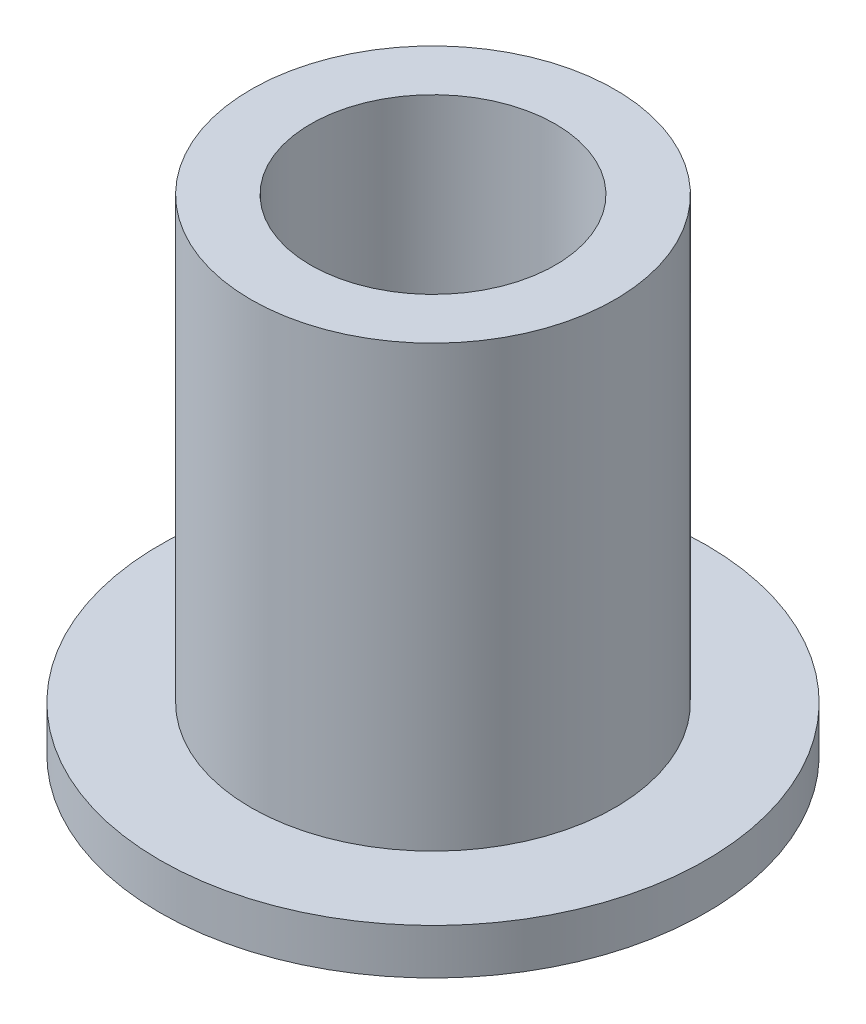
ISO-10303-21;
HEADER;
FILE_DESCRIPTION(('STEP AP214'),'2;1');
FILE_NAME('part.step','',(''),(''),'','','');
FILE_SCHEMA(('AUTOMOTIVE_DESIGN { 1 0 10303 214 1 1 1 1 }'));
ENDSEC;
DATA;
#1=APPLICATION_CONTEXT('core data for automotive mechanical design processes');
#2=APPLICATION_PROTOCOL_DEFINITION('international standard','automotive_design',2000,#1);
#3=PRODUCT_CONTEXT('',#1,'mechanical');
#4=PRODUCT('Part','Part','',(#3));
#5=PRODUCT_RELATED_PRODUCT_CATEGORY('part','',(#4));
#6=PRODUCT_DEFINITION_FORMATION('','',#4);
#7=PRODUCT_DEFINITION_CONTEXT('part definition',#1,'design');
#8=PRODUCT_DEFINITION('design','',#6,#7);
#9=PRODUCT_DEFINITION_SHAPE('','',#8);
#10=(LENGTH_UNIT() NAMED_UNIT(*) SI_UNIT(.MILLI.,.METRE.));
#11=(NAMED_UNIT(*) PLANE_ANGLE_UNIT() SI_UNIT($,.RADIAN.));
#12=(NAMED_UNIT(*) SI_UNIT($,.STERADIAN.) SOLID_ANGLE_UNIT());
#13=UNCERTAINTY_MEASURE_WITH_UNIT(LENGTH_MEASURE(1.E-05),#10,'distance_accuracy_value','');
#14=(GEOMETRIC_REPRESENTATION_CONTEXT(3) GLOBAL_UNCERTAINTY_ASSIGNED_CONTEXT((#13)) GLOBAL_UNIT_ASSIGNED_CONTEXT((#10,
#11,#12)) REPRESENTATION_CONTEXT('',''));
#15=CARTESIAN_POINT('',(0.,0.,0.));
#16=DIRECTION('',(0.,0.,1.));
#17=DIRECTION('',(1.,0.,0.));
#18=AXIS2_PLACEMENT_3D('',#15,#16,#17);
#19=CARTESIAN_POINT('',(0.,12.7,0.));
#20=DIRECTION('',(0.,1.,0.));
#21=DIRECTION('',(0.,0.,1.));
#22=AXIS2_PLACEMENT_3D('',#19,#20,#21);
#23=PLANE('',#22);
#24=CARTESIAN_POINT('',(0.,12.7,0.));
#25=DIRECTION('',(0.,1.,0.));
#26=DIRECTION('',(0.,0.,1.));
#27=AXIS2_PLACEMENT_3D('',#24,#25,#26);
#28=CIRCLE('',#27,4.7625);
#29=CARTESIAN_POINT('',(0.,12.7,4.7625));
#30=VERTEX_POINT('',#29);
#31=EDGE_CURVE('E10',#30,#30,#28,.T.);
#32=ORIENTED_EDGE('',*,*,#31,.T.);
#33=EDGE_LOOP('',(#32));
#34=FACE_BOUND('',#33,.T.);
#35=CARTESIAN_POINT('',(0.,12.7,0.));
#36=DIRECTION('',(0.,1.,0.));
#37=DIRECTION('',(0.,0.,1.));
#38=AXIS2_PLACEMENT_3D('',#35,#36,#37);
#39=CIRCLE('',#38,3.2004);
#40=CARTESIAN_POINT('',(0.,12.7,3.2004));
#41=VERTEX_POINT('',#40);
#42=EDGE_CURVE('E37',#41,#41,#39,.T.);
#43=ORIENTED_EDGE('',*,*,#42,.F.);
#44=EDGE_LOOP('',(#43));
#45=FACE_BOUND('',#44,.T.);
#46=ADVANCED_FACE('F30',(#34,#45),#23,.T.);
#47=CARTESIAN_POINT('',(0.,0.,0.));
#48=DIRECTION('',(0.,1.,0.));
#49=DIRECTION('',(0.,0.,1.));
#50=AXIS2_PLACEMENT_3D('',#47,#48,#49);
#51=PLANE('',#50);
#52=CARTESIAN_POINT('',(0.,0.,0.));
#53=DIRECTION('',(0.,1.,0.));
#54=DIRECTION('',(0.,0.,1.));
#55=AXIS2_PLACEMENT_3D('',#52,#53,#54);
#56=CIRCLE('',#55,3.2004);
#57=CARTESIAN_POINT('',(0.,0.,3.2004));
#58=VERTEX_POINT('',#57);
#59=EDGE_CURVE('E41',#58,#58,#56,.T.);
#60=ORIENTED_EDGE('',*,*,#59,.T.);
#61=EDGE_LOOP('',(#60));
#62=FACE_BOUND('',#61,.T.);
#63=CARTESIAN_POINT('',(0.,0.,0.));
#64=DIRECTION('',(0.,1.,0.));
#65=DIRECTION('',(0.,0.,1.));
#66=AXIS2_PLACEMENT_3D('',#63,#64,#65);
#67=CIRCLE('',#66,7.14375);
#68=CARTESIAN_POINT('',(0.,0.,-7.14375));
#69=VERTEX_POINT('',#68);
#70=EDGE_CURVE('E48',#69,#69,#67,.T.);
#71=ORIENTED_EDGE('',*,*,#70,.F.);
#72=EDGE_LOOP('',(#71));
#73=FACE_BOUND('',#72,.T.);
#74=ADVANCED_FACE('F73',(#62,#73),#51,.F.);
#75=CARTESIAN_POINT('',(0.,12.7,0.));
#76=DIRECTION('',(0.,-1.,0.));
#77=DIRECTION('',(0.,0.,-1.));
#78=AXIS2_PLACEMENT_3D('',#75,#76,#77);
#79=CYLINDRICAL_SURFACE('',#78,4.7625);
#80=CARTESIAN_POINT('',(0.,1.190625,0.));
#81=DIRECTION('',(0.,1.,0.));
#82=DIRECTION('',(0.,0.,1.));
#83=AXIS2_PLACEMENT_3D('',#80,#81,#82);
#84=CIRCLE('',#83,4.7625);
#85=CARTESIAN_POINT('',(0.,1.190625,4.7625));
#86=VERTEX_POINT('',#85);
#87=EDGE_CURVE('E51',#86,#86,#84,.T.);
#88=ORIENTED_EDGE('',*,*,#87,.T.);
#89=EDGE_LOOP('',(#88));
#90=FACE_BOUND('',#89,.T.);
#91=ORIENTED_EDGE('',*,*,#31,.F.);
#92=EDGE_LOOP('',(#91));
#93=FACE_BOUND('',#92,.T.);
#94=ADVANCED_FACE('F32',(#90,#93),#79,.T.);
#95=CARTESIAN_POINT('',(0.,12.7,0.));
#96=DIRECTION('',(0.,-1.,0.));
#97=DIRECTION('',(0.,0.,-1.));
#98=AXIS2_PLACEMENT_3D('',#95,#96,#97);
#99=CYLINDRICAL_SURFACE('',#98,3.2004);
#100=ORIENTED_EDGE('',*,*,#42,.T.);
#101=EDGE_LOOP('',(#100));
#102=FACE_BOUND('',#101,.T.);
#103=ORIENTED_EDGE('',*,*,#59,.F.);
#104=EDGE_LOOP('',(#103));
#105=FACE_BOUND('',#104,.T.);
#106=ADVANCED_FACE('F62',(#102,#105),#99,.F.);
#107=CARTESIAN_POINT('',(0.,1.190625,0.));
#108=DIRECTION('',(0.,1.,0.));
#109=DIRECTION('',(0.,0.,1.));
#110=AXIS2_PLACEMENT_3D('',#107,#108,#109);
#111=PLANE('',#110);
#112=CARTESIAN_POINT('',(0.,1.190625,0.));
#113=DIRECTION('',(0.,1.,0.));
#114=DIRECTION('',(0.,0.,1.));
#115=AXIS2_PLACEMENT_3D('',#112,#113,#114);
#116=CIRCLE('',#115,7.14375);
#117=CARTESIAN_POINT('',(0.,1.190625,-7.14375));
#118=VERTEX_POINT('',#117);
#119=EDGE_CURVE('E46',#118,#118,#116,.T.);
#120=ORIENTED_EDGE('',*,*,#119,.T.);
#121=EDGE_LOOP('',(#120));
#122=FACE_BOUND('',#121,.T.);
#123=ORIENTED_EDGE('',*,*,#87,.F.);
#124=EDGE_LOOP('',(#123));
#125=FACE_BOUND('',#124,.T.);
#126=ADVANCED_FACE('F59',(#122,#125),#111,.T.);
#127=CARTESIAN_POINT('',(0.,1.190625,0.));
#128=DIRECTION('',(0.,-1.,0.));
#129=DIRECTION('',(0.,0.,-1.));
#130=AXIS2_PLACEMENT_3D('',#127,#128,#129);
#131=CYLINDRICAL_SURFACE('',#130,7.14375);
#132=CARTESIAN_POINT('',(0.,1.190625,-7.14375));
#133=CARTESIAN_POINT('',(0.,1.17822265625,-7.14375));
#134=CARTESIAN_POINT('',(0.,1.1658203125,-7.14375));
#135=CARTESIAN_POINT('',(0.,1.141015625,-7.14375));
#136=CARTESIAN_POINT('',(0.,1.12861328125,-7.14375));
#137=CARTESIAN_POINT('',(0.,1.10380859375,-7.14375));
#138=CARTESIAN_POINT('',(0.,1.09140625,-7.14375));
#139=CARTESIAN_POINT('',(0.,1.0666015625,-7.14375));
#140=CARTESIAN_POINT('',(0.,1.05419921875,-7.14375));
#141=CARTESIAN_POINT('',(0.,1.02939453125,-7.14375));
#142=CARTESIAN_POINT('',(0.,1.0169921875,-7.14375));
#143=CARTESIAN_POINT('',(0.,0.9921875,-7.14375));
#144=CARTESIAN_POINT('',(0.,0.97978515625,-7.14375));
#145=CARTESIAN_POINT('',(0.,0.95498046875,-7.14375));
#146=CARTESIAN_POINT('',(0.,0.942578125,-7.14375));
#147=CARTESIAN_POINT('',(0.,0.9177734375,-7.14375));
#148=CARTESIAN_POINT('',(0.,0.90537109375,-7.14375));
#149=CARTESIAN_POINT('',(0.,0.88056640625,-7.14375));
#150=CARTESIAN_POINT('',(0.,0.8681640625,-7.14375));
#151=CARTESIAN_POINT('',(0.,0.843359375,-7.14375));
#152=CARTESIAN_POINT('',(0.,0.83095703125,-7.14375));
#153=CARTESIAN_POINT('',(0.,0.80615234375,-7.14375));
#154=CARTESIAN_POINT('',(0.,0.79375,-7.14375));
#155=CARTESIAN_POINT('',(0.,0.7689453125,-7.14375));
#156=CARTESIAN_POINT('',(0.,0.75654296875,-7.14375));
#157=CARTESIAN_POINT('',(0.,0.73173828125,-7.14375));
#158=CARTESIAN_POINT('',(0.,0.7193359375,-7.14375));
#159=CARTESIAN_POINT('',(0.,0.69453125,-7.14375));
#160=CARTESIAN_POINT('',(0.,0.68212890625,-7.14375));
#161=CARTESIAN_POINT('',(0.,0.65732421875,-7.14375));
#162=CARTESIAN_POINT('',(0.,0.644921875,-7.14375));
#163=CARTESIAN_POINT('',(0.,0.6201171875,-7.14375));
#164=CARTESIAN_POINT('',(0.,0.60771484375,-7.14375));
#165=CARTESIAN_POINT('',(0.,0.58291015625,-7.14375));
#166=CARTESIAN_POINT('',(0.,0.5705078125,-7.14375));
#167=CARTESIAN_POINT('',(0.,0.545703125,-7.14375));
#168=CARTESIAN_POINT('',(0.,0.53330078125,-7.14375));
#169=CARTESIAN_POINT('',(0.,0.50849609375,-7.14375));
#170=CARTESIAN_POINT('',(0.,0.49609375,-7.14375));
#171=CARTESIAN_POINT('',(0.,0.4712890625,-7.14375));
#172=CARTESIAN_POINT('',(0.,0.45888671875,-7.14375));
#173=CARTESIAN_POINT('',(0.,0.43408203125,-7.14375));
#174=CARTESIAN_POINT('',(0.,0.4216796875,-7.14375));
#175=CARTESIAN_POINT('',(0.,0.396875,-7.14375));
#176=CARTESIAN_POINT('',(0.,0.38447265625,-7.14375));
#177=CARTESIAN_POINT('',(0.,0.35966796875,-7.14375));
#178=CARTESIAN_POINT('',(0.,0.347265625,-7.14375));
#179=CARTESIAN_POINT('',(0.,0.3224609375,-7.14375));
#180=CARTESIAN_POINT('',(0.,0.31005859375,-7.14375));
#181=CARTESIAN_POINT('',(0.,0.28525390625,-7.14375));
#182=CARTESIAN_POINT('',(0.,0.2728515625,-7.14375));
#183=CARTESIAN_POINT('',(0.,0.248046875,-7.14375));
#184=CARTESIAN_POINT('',(0.,0.23564453125,-7.14375));
#185=CARTESIAN_POINT('',(0.,0.21083984375,-7.14375));
#186=CARTESIAN_POINT('',(0.,0.1984375,-7.14375));
#187=CARTESIAN_POINT('',(0.,0.1736328125,-7.14375));
#188=CARTESIAN_POINT('',(0.,0.16123046875,-7.14375));
#189=CARTESIAN_POINT('',(0.,0.13642578125,-7.14375));
#190=CARTESIAN_POINT('',(0.,0.1240234375,-7.14375));
#191=CARTESIAN_POINT('',(0.,0.0992187500000001,-7.14375));
#192=CARTESIAN_POINT('',(0.,0.08681640625,-7.14375));
#193=CARTESIAN_POINT('',(0.,0.06201171875,-7.14375));
#194=CARTESIAN_POINT('',(0.,0.049609375,-7.14375));
#195=CARTESIAN_POINT('',(0.,0.0248046875,-7.14375));
#196=CARTESIAN_POINT('',(0.,0.01240234375,-7.14375));
#197=CARTESIAN_POINT('',(0.,0.,-7.14375));
#198=B_SPLINE_CURVE_WITH_KNOTS('',3,(#132,#133,#134,#135,#136,#137,#138,#139,#140,#141,#142,
#143,#144,#145,#146,#147,#148,#149,#150,#151,#152,#153,#154,#155,#156,#157,#158,#159,#160,#161,
#162,#163,#164,#165,#166,#167,#168,#169,#170,#171,#172,#173,#174,#175,#176,#177,#178,#179,#180,
#181,#182,#183,#184,#185,#186,#187,#188,#189,#190,#191,#192,#193,#194,#195,#196,#197),
.UNSPECIFIED.,.F.,.F.,(4,2,2,2,2,2,2,2,2,2,2,2,2,2,2,2,2,2,2,2,2,2,2,2,2,2,2,2,2,2,2,2,4),(0.,
0.03720703125,0.0744140625,0.11162109375,0.148828125,0.18603515625,0.2232421875,0.26044921875,
0.29765625,0.33486328125,0.3720703125,0.40927734375,0.446484375,0.48369140625,0.5208984375,
0.55810546875,0.5953125,0.63251953125,0.6697265625,0.70693359375,0.744140625,0.78134765625,
0.8185546875,0.85576171875,0.89296875,0.93017578125,0.9673828125,1.00458984375,1.041796875,
1.07900390625,1.1162109375,1.15341796875,1.190625),.UNSPECIFIED.);
#199=EDGE_CURVE('BSEAM61',#118,#69,#198,.T.);
#200=ORIENTED_EDGE('',*,*,#119,.F.);
#201=ORIENTED_EDGE('',*,*,#70,.T.);
#202=ORIENTED_EDGE('',*,*,#199,.T.);
#203=ORIENTED_EDGE('',*,*,#199,.F.);
#204=EDGE_LOOP('',(#200,#202,#201,#203));
#205=FACE_BOUND('',#204,.T.);
#206=ADVANCED_FACE('F61',(#205),#131,.T.);
#207=CLOSED_SHELL('',(#46,#74,#94,#106,#126,#206));
#208=MANIFOLD_SOLID_BREP('B2',#207);
#209=ADVANCED_BREP_SHAPE_REPRESENTATION('',(#18,#208),#14);
#210=SHAPE_DEFINITION_REPRESENTATION(#9,#209);
ENDSEC;
END-ISO-10303-21;
